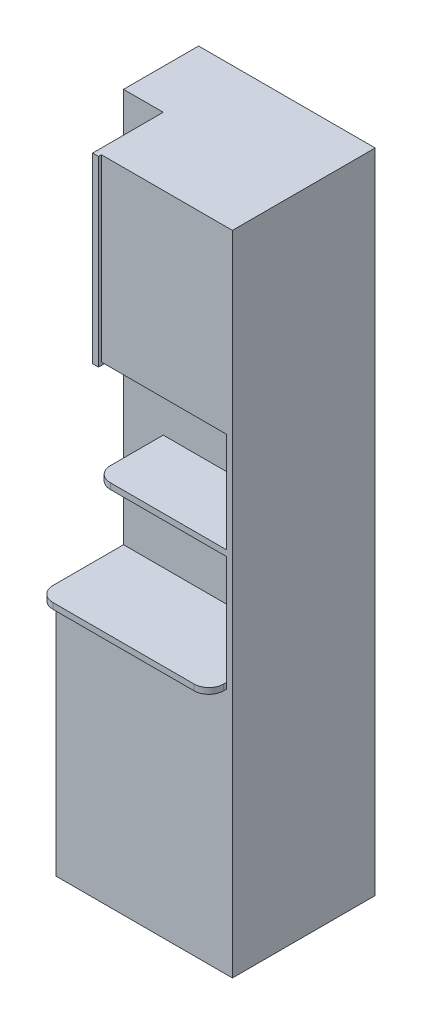
ISO-10303-21;
HEADER;
FILE_DESCRIPTION(('STEP AP214'),'2;1');
FILE_NAME('part.step','',(''),(''),'','','');
FILE_SCHEMA(('AUTOMOTIVE_DESIGN { 1 0 10303 214 1 1 1 1 }'));
ENDSEC;
DATA;
#1=APPLICATION_CONTEXT('core data for automotive mechanical design processes');
#2=APPLICATION_PROTOCOL_DEFINITION('international standard','automotive_design',2000,#1);
#3=PRODUCT_CONTEXT('',#1,'mechanical');
#4=PRODUCT('Part','Part','',(#3));
#5=PRODUCT_RELATED_PRODUCT_CATEGORY('part','',(#4));
#6=PRODUCT_DEFINITION_FORMATION('','',#4);
#7=PRODUCT_DEFINITION_CONTEXT('part definition',#1,'design');
#8=PRODUCT_DEFINITION('design','',#6,#7);
#9=PRODUCT_DEFINITION_SHAPE('','',#8);
#10=(LENGTH_UNIT() NAMED_UNIT(*) SI_UNIT(.MILLI.,.METRE.));
#11=(NAMED_UNIT(*) PLANE_ANGLE_UNIT() SI_UNIT($,.RADIAN.));
#12=(NAMED_UNIT(*) SI_UNIT($,.STERADIAN.) SOLID_ANGLE_UNIT());
#13=UNCERTAINTY_MEASURE_WITH_UNIT(LENGTH_MEASURE(1.E-05),#10,'distance_accuracy_value','');
#14=(GEOMETRIC_REPRESENTATION_CONTEXT(3) GLOBAL_UNCERTAINTY_ASSIGNED_CONTEXT((#13)) GLOBAL_UNIT_ASSIGNED_CONTEXT((#10,
#11,#12)) REPRESENTATION_CONTEXT('',''));
#15=CARTESIAN_POINT('',(0.,0.,0.));
#16=DIRECTION('',(0.,0.,1.));
#17=DIRECTION('',(1.,0.,0.));
#18=AXIS2_PLACEMENT_3D('',#15,#16,#17);
#19=CARTESIAN_POINT('',(-0.165000000000005,1.09999999999999,0.255));
#20=DIRECTION('',(0.,0.,-1.));
#21=DIRECTION('',(0.,1.,0.));
#22=AXIS2_PLACEMENT_3D('',#19,#20,#21);
#23=PLANE('',#22);
#24=DIRECTION('',(-1.,0.,0.));
#25=VECTOR('',#24,1.);
#26=CARTESIAN_POINT('',(0.279999999999998,-0.239999999999999,0.255));
#27=LINE('',#26,#25);
#28=CARTESIAN_POINT('',(0.279999999999998,-0.239999999999999,0.255));
#29=VERTEX_POINT('',#28);
#30=CARTESIAN_POINT('',(-0.300000000000002,-0.239999999999999,0.255));
#31=VERTEX_POINT('',#30);
#32=EDGE_CURVE('E193',#29,#31,#27,.T.);
#33=ORIENTED_EDGE('',*,*,#32,.F.);
#34=DIRECTION('',(0.,-1.,0.));
#35=VECTOR('',#34,1.);
#36=CARTESIAN_POINT('',(0.279999999999997,0.130000000000002,0.255));
#37=LINE('',#36,#35);
#38=CARTESIAN_POINT('',(0.279999999999997,0.130000000000002,0.255));
#39=VERTEX_POINT('',#38);
#40=EDGE_CURVE('E180',#39,#29,#37,.T.);
#41=ORIENTED_EDGE('',*,*,#40,.F.);
#42=DIRECTION('',(-1.,0.,0.));
#43=VECTOR('',#42,1.);
#44=CARTESIAN_POINT('',(0.279999999999997,0.130000000000002,0.255));
#45=LINE('',#44,#43);
#46=CARTESIAN_POINT('',(-0.165000000000003,0.13,0.255));
#47=VERTEX_POINT('',#46);
#48=EDGE_CURVE('E320',#39,#47,#45,.T.);
#49=ORIENTED_EDGE('',*,*,#48,.T.);
#50=DIRECTION('',(0.,-1.,0.));
#51=VECTOR('',#50,1.);
#52=CARTESIAN_POINT('',(-0.165000000000005,1.09999999999999,0.255));
#53=LINE('',#52,#51);
#54=CARTESIAN_POINT('',(-0.165000000000003,0.150000000000001,0.255));
#55=VERTEX_POINT('',#54);
#56=EDGE_CURVE('E324',#55,#47,#53,.T.);
#57=ORIENTED_EDGE('',*,*,#56,.F.);
#58=DIRECTION('',(-1.,0.,0.));
#59=VECTOR('',#58,1.);
#60=CARTESIAN_POINT('',(0.279999999999997,0.150000000000002,0.255));
#61=LINE('',#60,#59);
#62=CARTESIAN_POINT('',(0.279999999999997,0.150000000000002,0.255));
#63=VERTEX_POINT('',#62);
#64=EDGE_CURVE('E308',#63,#55,#61,.T.);
#65=ORIENTED_EDGE('',*,*,#64,.F.);
#66=DIRECTION('',(0.,-1.,0.));
#67=VECTOR('',#66,1.);
#68=CARTESIAN_POINT('',(0.279999999999996,0.490000000000002,0.255));
#69=LINE('',#68,#67);
#70=CARTESIAN_POINT('',(0.279999999999996,0.490000000000002,0.255));
#71=VERTEX_POINT('',#70);
#72=EDGE_CURVE('E295',#71,#63,#69,.T.);
#73=ORIENTED_EDGE('',*,*,#72,.F.);
#74=DIRECTION('',(-1.,0.,0.));
#75=VECTOR('',#74,1.);
#76=CARTESIAN_POINT('',(0.279999999999996,0.490000000000002,0.255));
#77=LINE('',#76,#75);
#78=CARTESIAN_POINT('',(-0.145000000000004,0.490000000000001,0.255));
#79=VERTEX_POINT('',#78);
#80=EDGE_CURVE('E310',#71,#79,#77,.T.);
#81=ORIENTED_EDGE('',*,*,#80,.T.);
#82=DIRECTION('',(0.,-1.,0.));
#83=VECTOR('',#82,1.);
#84=CARTESIAN_POINT('',(-0.145000000000005,1.09999999999999,0.255));
#85=LINE('',#84,#83);
#86=CARTESIAN_POINT('',(-0.145000000000004,0.47999999999999,0.255));
#87=VERTEX_POINT('',#86);
#88=EDGE_CURVE('E266',#79,#87,#85,.T.);
#89=ORIENTED_EDGE('',*,*,#88,.T.);
#90=DIRECTION('',(1.,0.,0.));
#91=VECTOR('',#90,1.);
#92=CARTESIAN_POINT('',(-0.165000000000004,0.47999999999999,0.255));
#93=LINE('',#92,#91);
#94=CARTESIAN_POINT('',(-0.165000000000004,0.47999999999999,0.255));
#95=VERTEX_POINT('',#94);
#96=EDGE_CURVE('E279',#95,#87,#93,.T.);
#97=ORIENTED_EDGE('',*,*,#96,.F.);
#98=DIRECTION('',(0.,-1.,0.));
#99=VECTOR('',#98,1.);
#100=CARTESIAN_POINT('',(-0.165000000000005,1.09999999999999,0.255));
#101=LINE('',#100,#99);
#102=CARTESIAN_POINT('',(-0.165000000000005,1.09999999999999,0.255));
#103=VERTEX_POINT('',#102);
#104=EDGE_CURVE('E254',#103,#95,#101,.T.);
#105=ORIENTED_EDGE('',*,*,#104,.F.);
#106=DIRECTION('',(-1.,0.,0.));
#107=VECTOR('',#106,1.);
#108=CARTESIAN_POINT('',(-0.165000000000005,1.09999999999999,0.255));
#109=LINE('',#108,#107);
#110=CARTESIAN_POINT('',(-0.300000000000005,1.09999999999999,0.255));
#111=VERTEX_POINT('',#110);
#112=EDGE_CURVE('E327',#103,#111,#109,.T.);
#113=ORIENTED_EDGE('',*,*,#112,.T.);
#114=DIRECTION('',(0.,-1.,0.));
#115=VECTOR('',#114,1.);
#116=CARTESIAN_POINT('',(-0.300000000000005,1.09999999999999,0.255));
#117=LINE('',#116,#115);
#118=EDGE_CURVE('E195',#111,#31,#117,.T.);
#119=ORIENTED_EDGE('',*,*,#118,.T.);
#120=EDGE_LOOP('',(#33,#41,#49,#57,#65,#73,#81,#89,#97,#105,#113,#119));
#121=FACE_BOUND('',#120,.T.);
#122=ADVANCED_FACE('F33',(#121),#23,.F.);
#123=CARTESIAN_POINT('',(0.279999999999997,0.,0.));
#124=DIRECTION('',(1.,0.,0.));
#125=DIRECTION('',(0.,1.,0.));
#126=AXIS2_PLACEMENT_3D('',#123,#124,#125);
#127=PLANE('',#126);
#128=DIRECTION('',(0.,0.,-1.));
#129=VECTOR('',#128,1.);
#130=CARTESIAN_POINT('',(0.279999999999998,-0.239999999999998,0.));
#131=LINE('',#130,#129);
#132=CARTESIAN_POINT('',(0.279999999999998,-0.239999999999999,0.485));
#133=VERTEX_POINT('',#132);
#134=EDGE_CURVE('E184',#133,#29,#131,.T.);
#135=ORIENTED_EDGE('',*,*,#134,.F.);
#136=DIRECTION('',(0.,1.,0.));
#137=VECTOR('',#136,1.);
#138=CARTESIAN_POINT('',(0.279999999999997,0.130000000000002,0.485));
#139=LINE('',#138,#137);
#140=CARTESIAN_POINT('',(0.279999999999997,0.130000000000002,0.485));
#141=VERTEX_POINT('',#140);
#142=EDGE_CURVE('E317',#133,#141,#139,.T.);
#143=ORIENTED_EDGE('',*,*,#142,.T.);
#144=DIRECTION('',(0.,0.,-1.));
#145=VECTOR('',#144,1.);
#146=CARTESIAN_POINT('',(0.279999999999997,0.130000000000002,0.485));
#147=LINE('',#146,#145);
#148=EDGE_CURVE('E187',#141,#39,#147,.T.);
#149=ORIENTED_EDGE('',*,*,#148,.T.);
#150=ORIENTED_EDGE('',*,*,#40,.T.);
#151=EDGE_LOOP('',(#135,#143,#149,#150));
#152=FACE_BOUND('',#151,.T.);
#153=ADVANCED_FACE('F182',(#152),#127,.F.);
#154=CARTESIAN_POINT('',(-0.165000000000003,0.,0.));
#155=DIRECTION('',(1.,0.,0.));
#156=DIRECTION('',(0.,1.,0.));
#157=AXIS2_PLACEMENT_3D('',#154,#155,#156);
#158=PLANE('',#157);
#159=DIRECTION('',(0.,0.,-1.));
#160=VECTOR('',#159,1.);
#161=CARTESIAN_POINT('',(-0.165000000000003,0.13,0.485));
#162=LINE('',#161,#160);
#163=CARTESIAN_POINT('',(-0.165000000000003,0.13,0.435));
#164=VERTEX_POINT('',#163);
#165=EDGE_CURVE('E307',#164,#47,#162,.T.);
#166=ORIENTED_EDGE('',*,*,#165,.F.);
#167=DIRECTION('',(0.,1.,0.));
#168=VECTOR('',#167,1.);
#169=CARTESIAN_POINT('',(-0.165000000000003,0.,0.435));
#170=LINE('',#169,#168);
#171=CARTESIAN_POINT('',(-0.165000000000003,0.150000000000001,0.435));
#172=VERTEX_POINT('',#171);
#173=EDGE_CURVE('E220',#164,#172,#170,.T.);
#174=ORIENTED_EDGE('',*,*,#173,.T.);
#175=DIRECTION('',(0.,0.,1.));
#176=VECTOR('',#175,1.);
#177=CARTESIAN_POINT('',(-0.165000000000003,0.150000000000001,0.485));
#178=LINE('',#177,#176);
#179=EDGE_CURVE('E288',#55,#172,#178,.T.);
#180=ORIENTED_EDGE('',*,*,#179,.F.);
#181=ORIENTED_EDGE('',*,*,#56,.T.);
#182=EDGE_LOOP('',(#166,#174,#180,#181));
#183=FACE_BOUND('',#182,.T.);
#184=ADVANCED_FACE('F399',(#183),#158,.F.);
#185=CARTESIAN_POINT('',(-0.300000000000005,1.09999999999999,0.485));
#186=DIRECTION('',(1.,0.,0.));
#187=DIRECTION('',(0.,1.,0.));
#188=AXIS2_PLACEMENT_3D('',#185,#186,#187);
#189=PLANE('',#188);
#190=DIRECTION('',(0.,0.,1.));
#191=VECTOR('',#190,1.);
#192=CARTESIAN_POINT('',(-0.300000000000002,-0.26,0.255));
#193=LINE('',#192,#191);
#194=CARTESIAN_POINT('',(-0.300000000000002,-0.26,0.485));
#195=VERTEX_POINT('',#194);
#196=CARTESIAN_POINT('',(-0.300000000000002,-0.26,0.495));
#197=VERTEX_POINT('',#196);
#198=EDGE_CURVE('E244',#195,#197,#193,.T.);
#199=ORIENTED_EDGE('',*,*,#198,.T.);
#200=DIRECTION('',(0.,-1.,0.));
#201=VECTOR('',#200,1.);
#202=CARTESIAN_POINT('',(-0.300000000000005,1.09999999999999,0.495000000000001));
#203=LINE('',#202,#201);
#204=CARTESIAN_POINT('',(-0.300000000000002,-0.24,0.495));
#205=VERTEX_POINT('',#204);
#206=EDGE_CURVE('E216',#197,#205,#203,.F.);
#207=ORIENTED_EDGE('',*,*,#206,.T.);
#208=DIRECTION('',(0.,0.,1.));
#209=VECTOR('',#208,1.);
#210=CARTESIAN_POINT('',(-0.300000000000002,-0.24,0.255));
#211=LINE('',#210,#209);
#212=EDGE_CURVE('E199',#31,#205,#211,.T.);
#213=ORIENTED_EDGE('',*,*,#212,.F.);
#214=ORIENTED_EDGE('',*,*,#118,.F.);
#215=DIRECTION('',(0.,0.,-1.));
#216=VECTOR('',#215,1.);
#217=CARTESIAN_POINT('',(-0.300000000000005,1.09999999999999,0.485));
#218=LINE('',#217,#216);
#219=CARTESIAN_POINT('',(-0.300000000000005,1.09999999999999,0.));
#220=VERTEX_POINT('',#219);
#221=EDGE_CURVE('E341',#111,#220,#218,.T.);
#222=ORIENTED_EDGE('',*,*,#221,.T.);
#223=DIRECTION('',(0.,-1.,0.));
#224=VECTOR('',#223,1.);
#225=CARTESIAN_POINT('',(-0.300000000000005,1.09999999999999,0.));
#226=LINE('',#225,#224);
#227=CARTESIAN_POINT('',(-0.3,-1.1,0.));
#228=VERTEX_POINT('',#227);
#229=EDGE_CURVE('E330',#220,#228,#226,.T.);
#230=ORIENTED_EDGE('',*,*,#229,.T.);
#231=DIRECTION('',(0.,0.,-1.));
#232=VECTOR('',#231,1.);
#233=CARTESIAN_POINT('',(-0.3,-1.1,0.485));
#234=LINE('',#233,#232);
#235=CARTESIAN_POINT('',(-0.3,-1.1,0.485));
#236=VERTEX_POINT('',#235);
#237=EDGE_CURVE('E205',#236,#228,#234,.T.);
#238=ORIENTED_EDGE('',*,*,#237,.F.);
#239=DIRECTION('',(0.,-1.,0.));
#240=VECTOR('',#239,1.);
#241=CARTESIAN_POINT('',(-0.300000000000005,1.09999999999999,0.485));
#242=LINE('',#241,#240);
#243=EDGE_CURVE('E332',#195,#236,#242,.T.);
#244=ORIENTED_EDGE('',*,*,#243,.F.);
#245=EDGE_LOOP('',(#199,#207,#213,#214,#222,#230,#238,#244));
#246=FACE_BOUND('',#245,.T.);
#247=ADVANCED_FACE('F404',(#246),#189,.F.);
#248=CARTESIAN_POINT('',(0.3,-1.1,0.485));
#249=DIRECTION('',(0.,1.,0.));
#250=DIRECTION('',(0.,0.,1.));
#251=AXIS2_PLACEMENT_3D('',#248,#249,#250);
#252=PLANE('',#251);
#253=DIRECTION('',(1.,0.,0.));
#254=VECTOR('',#253,1.);
#255=CARTESIAN_POINT('',(0.3,-1.1,0.));
#256=LINE('',#255,#254);
#257=CARTESIAN_POINT('',(0.3,-1.1,0.));
#258=VERTEX_POINT('',#257);
#259=EDGE_CURVE('E344',#228,#258,#256,.T.);
#260=ORIENTED_EDGE('',*,*,#259,.T.);
#261=DIRECTION('',(0.,0.,-1.));
#262=VECTOR('',#261,1.);
#263=CARTESIAN_POINT('',(0.3,-1.1,0.485));
#264=LINE('',#263,#262);
#265=CARTESIAN_POINT('',(0.3,-1.1,0.485));
#266=VERTEX_POINT('',#265);
#267=EDGE_CURVE('E211',#266,#258,#264,.T.);
#268=ORIENTED_EDGE('',*,*,#267,.F.);
#269=DIRECTION('',(1.,0.,0.));
#270=VECTOR('',#269,1.);
#271=CARTESIAN_POINT('',(0.3,-1.1,0.485));
#272=LINE('',#271,#270);
#273=EDGE_CURVE('E334',#236,#266,#272,.T.);
#274=ORIENTED_EDGE('',*,*,#273,.F.);
#275=ORIENTED_EDGE('',*,*,#237,.T.);
#276=EDGE_LOOP('',(#260,#268,#274,#275));
#277=FACE_BOUND('',#276,.T.);
#278=ADVANCED_FACE('F433',(#277),#252,.F.);
#279=CARTESIAN_POINT('',(0.3,1.1,0.485));
#280=DIRECTION('',(-1.,0.,0.));
#281=DIRECTION('',(0.,-1.,0.));
#282=AXIS2_PLACEMENT_3D('',#279,#280,#281);
#283=PLANE('',#282);
#284=DIRECTION('',(0.,1.,0.));
#285=VECTOR('',#284,1.);
#286=CARTESIAN_POINT('',(0.3,1.1,0.));
#287=LINE('',#286,#285);
#288=CARTESIAN_POINT('',(0.3,1.1,0.));
#289=VERTEX_POINT('',#288);
#290=EDGE_CURVE('E346',#258,#289,#287,.T.);
#291=ORIENTED_EDGE('',*,*,#290,.T.);
#292=DIRECTION('',(0.,0.,-1.));
#293=VECTOR('',#292,1.);
#294=CARTESIAN_POINT('',(0.3,1.1,0.485));
#295=LINE('',#294,#293);
#296=CARTESIAN_POINT('',(0.3,1.1,0.485));
#297=VERTEX_POINT('',#296);
#298=EDGE_CURVE('E351',#297,#289,#295,.T.);
#299=ORIENTED_EDGE('',*,*,#298,.F.);
#300=DIRECTION('',(0.,1.,0.));
#301=VECTOR('',#300,1.);
#302=CARTESIAN_POINT('',(0.3,1.1,0.485));
#303=LINE('',#302,#301);
#304=EDGE_CURVE('E337',#266,#297,#303,.T.);
#305=ORIENTED_EDGE('',*,*,#304,.F.);
#306=ORIENTED_EDGE('',*,*,#267,.T.);
#307=EDGE_LOOP('',(#291,#299,#305,#306));
#308=FACE_BOUND('',#307,.T.);
#309=ADVANCED_FACE('F358',(#308),#283,.F.);
#310=CARTESIAN_POINT('',(0.3,1.1,0.485));
#311=DIRECTION('',(0.,-1.,0.));
#312=DIRECTION('',(1.,0.,0.));
#313=AXIS2_PLACEMENT_3D('',#310,#311,#312);
#314=PLANE('',#313);
#315=ORIENTED_EDGE('',*,*,#112,.F.);
#316=DIRECTION('',(0.,0.,-1.));
#317=VECTOR('',#316,1.);
#318=CARTESIAN_POINT('',(-0.165000000000005,1.09999999999999,0.255));
#319=LINE('',#318,#317);
#320=CARTESIAN_POINT('',(-0.165000000000005,1.09999999999999,0.495));
#321=VERTEX_POINT('',#320);
#322=EDGE_CURVE('E262',#321,#103,#319,.T.);
#323=ORIENTED_EDGE('',*,*,#322,.F.);
#324=DIRECTION('',(1.,0.,0.));
#325=VECTOR('',#324,1.);
#326=CARTESIAN_POINT('',(-0.165000000000005,1.09999999999999,0.495));
#327=LINE('',#326,#325);
#328=CARTESIAN_POINT('',(-0.145000000000005,1.09999999999999,0.495));
#329=VERTEX_POINT('',#328);
#330=EDGE_CURVE('E265',#321,#329,#327,.T.);
#331=ORIENTED_EDGE('',*,*,#330,.T.);
#332=DIRECTION('',(0.,0.,-1.));
#333=VECTOR('',#332,1.);
#334=CARTESIAN_POINT('',(-0.145000000000005,1.09999999999999,0.255));
#335=LINE('',#334,#333);
#336=CARTESIAN_POINT('',(-0.145000000000005,1.09999999999999,0.485));
#337=VERTEX_POINT('',#336);
#338=EDGE_CURVE('E258',#329,#337,#335,.T.);
#339=ORIENTED_EDGE('',*,*,#338,.T.);
#340=DIRECTION('',(-1.,0.,0.));
#341=VECTOR('',#340,1.);
#342=CARTESIAN_POINT('',(0.3,1.1,0.485));
#343=LINE('',#342,#341);
#344=EDGE_CURVE('E339',#297,#337,#343,.T.);
#345=ORIENTED_EDGE('',*,*,#344,.F.);
#346=ORIENTED_EDGE('',*,*,#298,.T.);
#347=DIRECTION('',(-1.,0.,0.));
#348=VECTOR('',#347,1.);
#349=CARTESIAN_POINT('',(0.3,1.1,0.));
#350=LINE('',#349,#348);
#351=EDGE_CURVE('E335',#289,#220,#350,.T.);
#352=ORIENTED_EDGE('',*,*,#351,.T.);
#353=ORIENTED_EDGE('',*,*,#221,.F.);
#354=EDGE_LOOP('',(#315,#323,#331,#339,#345,#346,#352,#353));
#355=FACE_BOUND('',#354,.T.);
#356=ADVANCED_FACE('F369',(#355),#314,.F.);
#357=CARTESIAN_POINT('',(0.,0.,0.485));
#358=DIRECTION('',(0.,0.,-1.));
#359=DIRECTION('',(-1.,0.,0.));
#360=AXIS2_PLACEMENT_3D('',#357,#358,#359);
#361=PLANE('',#360);
#362=DIRECTION('',(-1.,0.,0.));
#363=VECTOR('',#362,1.);
#364=CARTESIAN_POINT('',(0.279999999999997,0.150000000000002,0.485));
#365=LINE('',#364,#363);
#366=CARTESIAN_POINT('',(0.279999999999997,0.150000000000002,0.485));
#367=VERTEX_POINT('',#366);
#368=CARTESIAN_POINT('',(-0.115000000000003,0.150000000000001,0.485));
#369=VERTEX_POINT('',#368);
#370=EDGE_CURVE('E304',#367,#369,#365,.T.);
#371=ORIENTED_EDGE('',*,*,#370,.T.);
#372=DIRECTION('',(0.,1.,0.));
#373=VECTOR('',#372,1.);
#374=CARTESIAN_POINT('',(-0.115000000000003,0.,0.485));
#375=LINE('',#374,#373);
#376=CARTESIAN_POINT('',(-0.115000000000003,0.130000000000001,0.485));
#377=VERTEX_POINT('',#376);
#378=EDGE_CURVE('E225',#369,#377,#375,.F.);
#379=ORIENTED_EDGE('',*,*,#378,.T.);
#380=DIRECTION('',(-1.,0.,0.));
#381=VECTOR('',#380,1.);
#382=CARTESIAN_POINT('',(0.279999999999997,0.130000000000002,0.485));
#383=LINE('',#382,#381);
#384=EDGE_CURVE('E190',#141,#377,#383,.T.);
#385=ORIENTED_EDGE('',*,*,#384,.F.);
#386=ORIENTED_EDGE('',*,*,#142,.F.);
#387=CARTESIAN_POINT('',(0.279999999999998,-0.259999999999999,0.485));
#388=VERTEX_POINT('',#387);
#389=EDGE_CURVE('E315',#388,#133,#139,.T.);
#390=ORIENTED_EDGE('',*,*,#389,.F.);
#391=DIRECTION('',(-1.,0.,0.));
#392=VECTOR('',#391,1.);
#393=CARTESIAN_POINT('',(-0.165000000000002,-0.26,0.485));
#394=LINE('',#393,#392);
#395=EDGE_CURVE('E243',#388,#195,#394,.T.);
#396=ORIENTED_EDGE('',*,*,#395,.T.);
#397=ORIENTED_EDGE('',*,*,#243,.T.);
#398=ORIENTED_EDGE('',*,*,#273,.T.);
#399=ORIENTED_EDGE('',*,*,#304,.T.);
#400=ORIENTED_EDGE('',*,*,#344,.T.);
#401=DIRECTION('',(0.,1.,0.));
#402=VECTOR('',#401,1.);
#403=CARTESIAN_POINT('',(-0.145000000000005,1.09999999999999,0.485));
#404=LINE('',#403,#402);
#405=CARTESIAN_POINT('',(-0.145000000000004,0.490000000000001,0.485));
#406=VERTEX_POINT('',#405);
#407=EDGE_CURVE('E282',#406,#337,#404,.T.);
#408=ORIENTED_EDGE('',*,*,#407,.F.);
#409=DIRECTION('',(-1.,0.,0.));
#410=VECTOR('',#409,1.);
#411=CARTESIAN_POINT('',(0.279999999999996,0.490000000000002,0.485));
#412=LINE('',#411,#410);
#413=CARTESIAN_POINT('',(0.279999999999996,0.490000000000002,0.485));
#414=VERTEX_POINT('',#413);
#415=EDGE_CURVE('E301',#414,#406,#412,.T.);
#416=ORIENTED_EDGE('',*,*,#415,.F.);
#417=DIRECTION('',(0.,1.,0.));
#418=VECTOR('',#417,1.);
#419=CARTESIAN_POINT('',(0.279999999999996,0.490000000000002,0.485));
#420=LINE('',#419,#418);
#421=EDGE_CURVE('E289',#367,#414,#420,.T.);
#422=ORIENTED_EDGE('',*,*,#421,.F.);
#423=EDGE_LOOP('',(#371,#379,#385,#386,#390,#396,#397,#398,#399,#400,#408,#416,#422));
#424=FACE_BOUND('',#423,.T.);
#425=ADVANCED_FACE('F373',(#424),#361,.F.);
#426=CARTESIAN_POINT('',(0.,0.,0.));
#427=DIRECTION('',(0.,0.,-1.));
#428=DIRECTION('',(-1.,0.,0.));
#429=AXIS2_PLACEMENT_3D('',#426,#427,#428);
#430=PLANE('',#429);
#431=ORIENTED_EDGE('',*,*,#229,.F.);
#432=ORIENTED_EDGE('',*,*,#351,.F.);
#433=ORIENTED_EDGE('',*,*,#290,.F.);
#434=ORIENTED_EDGE('',*,*,#259,.F.);
#435=EDGE_LOOP('',(#431,#432,#433,#434));
#436=FACE_BOUND('',#435,.T.);
#437=ADVANCED_FACE('F365',(#436),#430,.T.);
#438=CARTESIAN_POINT('',(0.279999999999997,0.130000000000002,0.485));
#439=DIRECTION('',(0.,1.,0.));
#440=DIRECTION('',(-1.,0.,0.));
#441=AXIS2_PLACEMENT_3D('',#438,#439,#440);
#442=PLANE('',#441);
#443=ORIENTED_EDGE('',*,*,#384,.T.);
#444=CARTESIAN_POINT('',(-0.115000000000003,0.130000000000001,0.435));
#445=DIRECTION('',(0.,1.,0.));
#446=DIRECTION('',(-1.,0.,0.));
#447=AXIS2_PLACEMENT_3D('',#444,#445,#446);
#448=CIRCLE('',#447,0.05);
#449=EDGE_CURVE('E227',#377,#164,#448,.F.);
#450=ORIENTED_EDGE('',*,*,#449,.T.);
#451=ORIENTED_EDGE('',*,*,#165,.T.);
#452=ORIENTED_EDGE('',*,*,#48,.F.);
#453=ORIENTED_EDGE('',*,*,#148,.F.);
#454=EDGE_LOOP('',(#443,#450,#451,#452,#453));
#455=FACE_BOUND('',#454,.T.);
#456=ADVANCED_FACE('F397',(#455),#442,.F.);
#457=CARTESIAN_POINT('',(0.279999999999997,0.150000000000002,0.485));
#458=DIRECTION('',(0.,-1.,0.));
#459=DIRECTION('',(1.,0.,0.));
#460=AXIS2_PLACEMENT_3D('',#457,#458,#459);
#461=PLANE('',#460);
#462=ORIENTED_EDGE('',*,*,#179,.T.);
#463=CARTESIAN_POINT('',(-0.115000000000003,0.150000000000001,0.435));
#464=DIRECTION('',(0.,-1.,0.));
#465=DIRECTION('',(1.,0.,0.));
#466=AXIS2_PLACEMENT_3D('',#463,#464,#465);
#467=CIRCLE('',#466,0.05);
#468=EDGE_CURVE('E223',#172,#369,#467,.F.);
#469=ORIENTED_EDGE('',*,*,#468,.T.);
#470=ORIENTED_EDGE('',*,*,#370,.F.);
#471=DIRECTION('',(0.,0.,1.));
#472=VECTOR('',#471,1.);
#473=CARTESIAN_POINT('',(0.279999999999997,0.150000000000002,0.485));
#474=LINE('',#473,#472);
#475=EDGE_CURVE('E298',#63,#367,#474,.T.);
#476=ORIENTED_EDGE('',*,*,#475,.F.);
#477=ORIENTED_EDGE('',*,*,#64,.T.);
#478=EDGE_LOOP('',(#462,#469,#470,#476,#477));
#479=FACE_BOUND('',#478,.T.);
#480=ADVANCED_FACE('F468',(#479),#461,.F.);
#481=CARTESIAN_POINT('',(0.279999999999996,0.490000000000002,0.485));
#482=DIRECTION('',(0.,1.,0.));
#483=DIRECTION('',(-1.,0.,0.));
#484=AXIS2_PLACEMENT_3D('',#481,#482,#483);
#485=PLANE('',#484);
#486=ORIENTED_EDGE('',*,*,#415,.T.);
#487=DIRECTION('',(0.,0.,1.));
#488=VECTOR('',#487,1.);
#489=CARTESIAN_POINT('',(-0.145000000000004,0.490000000000001,0.485));
#490=LINE('',#489,#488);
#491=EDGE_CURVE('E285',#79,#406,#490,.T.);
#492=ORIENTED_EDGE('',*,*,#491,.F.);
#493=ORIENTED_EDGE('',*,*,#80,.F.);
#494=DIRECTION('',(0.,0.,-1.));
#495=VECTOR('',#494,1.);
#496=CARTESIAN_POINT('',(0.279999999999996,0.490000000000002,0.485));
#497=LINE('',#496,#495);
#498=EDGE_CURVE('E292',#414,#71,#497,.T.);
#499=ORIENTED_EDGE('',*,*,#498,.F.);
#500=EDGE_LOOP('',(#486,#492,#493,#499));
#501=FACE_BOUND('',#500,.T.);
#502=ADVANCED_FACE('F381',(#501),#485,.F.);
#503=CARTESIAN_POINT('',(0.279999999999997,0.,0.));
#504=DIRECTION('',(1.,0.,0.));
#505=DIRECTION('',(0.,1.,0.));
#506=AXIS2_PLACEMENT_3D('',#503,#504,#505);
#507=PLANE('',#506);
#508=ORIENTED_EDGE('',*,*,#421,.T.);
#509=ORIENTED_EDGE('',*,*,#498,.T.);
#510=ORIENTED_EDGE('',*,*,#72,.T.);
#511=ORIENTED_EDGE('',*,*,#475,.T.);
#512=EDGE_LOOP('',(#508,#509,#510,#511));
#513=FACE_BOUND('',#512,.T.);
#514=ADVANCED_FACE('F386',(#513),#507,.F.);
#515=CARTESIAN_POINT('',(-0.145000000000003,0.,0.));
#516=DIRECTION('',(-1.,0.,0.));
#517=DIRECTION('',(0.,-1.,0.));
#518=AXIS2_PLACEMENT_3D('',#515,#516,#517);
#519=PLANE('',#518);
#520=ORIENTED_EDGE('',*,*,#491,.T.);
#521=ORIENTED_EDGE('',*,*,#407,.T.);
#522=ORIENTED_EDGE('',*,*,#338,.F.);
#523=DIRECTION('',(0.,1.,0.));
#524=VECTOR('',#523,1.);
#525=CARTESIAN_POINT('',(-0.145000000000005,1.09999999999999,0.495));
#526=LINE('',#525,#524);
#527=CARTESIAN_POINT('',(-0.145000000000004,0.47999999999999,0.495));
#528=VERTEX_POINT('',#527);
#529=EDGE_CURVE('E270',#528,#329,#526,.T.);
#530=ORIENTED_EDGE('',*,*,#529,.F.);
#531=DIRECTION('',(0.,0.,1.));
#532=VECTOR('',#531,1.);
#533=CARTESIAN_POINT('',(-0.145000000000004,0.47999999999999,0.255));
#534=LINE('',#533,#532);
#535=EDGE_CURVE('E268',#87,#528,#534,.T.);
#536=ORIENTED_EDGE('',*,*,#535,.F.);
#537=ORIENTED_EDGE('',*,*,#88,.F.);
#538=EDGE_LOOP('',(#520,#521,#522,#530,#536,#537));
#539=FACE_BOUND('',#538,.T.);
#540=ADVANCED_FACE('F376',(#539),#519,.F.);
#541=CARTESIAN_POINT('',(-0.165000000000004,0.47999999999999,0.255));
#542=DIRECTION('',(0.,1.,0.));
#543=DIRECTION('',(-1.,0.,0.));
#544=AXIS2_PLACEMENT_3D('',#541,#542,#543);
#545=PLANE('',#544);
#546=ORIENTED_EDGE('',*,*,#535,.T.);
#547=DIRECTION('',(1.,0.,0.));
#548=VECTOR('',#547,1.);
#549=CARTESIAN_POINT('',(-0.165000000000004,0.47999999999999,0.495));
#550=LINE('',#549,#548);
#551=CARTESIAN_POINT('',(-0.165000000000004,0.47999999999999,0.495));
#552=VERTEX_POINT('',#551);
#553=EDGE_CURVE('E276',#552,#528,#550,.T.);
#554=ORIENTED_EDGE('',*,*,#553,.F.);
#555=DIRECTION('',(0.,0.,1.));
#556=VECTOR('',#555,1.);
#557=CARTESIAN_POINT('',(-0.165000000000004,0.47999999999999,0.255));
#558=LINE('',#557,#556);
#559=EDGE_CURVE('E257',#95,#552,#558,.T.);
#560=ORIENTED_EDGE('',*,*,#559,.F.);
#561=ORIENTED_EDGE('',*,*,#96,.T.);
#562=EDGE_LOOP('',(#546,#554,#560,#561));
#563=FACE_BOUND('',#562,.T.);
#564=ADVANCED_FACE('F459',(#563),#545,.F.);
#565=CARTESIAN_POINT('',(-0.165000000000005,1.09999999999999,0.495));
#566=DIRECTION('',(0.,0.,-1.));
#567=DIRECTION('',(0.,1.,0.));
#568=AXIS2_PLACEMENT_3D('',#565,#566,#567);
#569=PLANE('',#568);
#570=ORIENTED_EDGE('',*,*,#529,.T.);
#571=ORIENTED_EDGE('',*,*,#330,.F.);
#572=DIRECTION('',(0.,1.,0.));
#573=VECTOR('',#572,1.);
#574=CARTESIAN_POINT('',(-0.165000000000005,1.09999999999999,0.495));
#575=LINE('',#574,#573);
#576=EDGE_CURVE('E260',#552,#321,#575,.T.);
#577=ORIENTED_EDGE('',*,*,#576,.F.);
#578=ORIENTED_EDGE('',*,*,#553,.T.);
#579=EDGE_LOOP('',(#570,#571,#577,#578));
#580=FACE_BOUND('',#579,.T.);
#581=ADVANCED_FACE('F455',(#580),#569,.F.);
#582=CARTESIAN_POINT('',(-0.165000000000003,0.,0.));
#583=DIRECTION('',(-1.,0.,0.));
#584=DIRECTION('',(0.,-1.,0.));
#585=AXIS2_PLACEMENT_3D('',#582,#583,#584);
#586=PLANE('',#585);
#587=ORIENTED_EDGE('',*,*,#104,.T.);
#588=ORIENTED_EDGE('',*,*,#559,.T.);
#589=ORIENTED_EDGE('',*,*,#576,.T.);
#590=ORIENTED_EDGE('',*,*,#322,.T.);
#591=EDGE_LOOP('',(#587,#588,#589,#590));
#592=FACE_BOUND('',#591,.T.);
#593=ADVANCED_FACE('F452',(#592),#586,.T.);
#594=CARTESIAN_POINT('',(0.279999999999998,-0.239999999999999,0.255));
#595=DIRECTION('',(-1.,0.,0.));
#596=DIRECTION('',(0.,-1.,0.));
#597=AXIS2_PLACEMENT_3D('',#594,#595,#596);
#598=PLANE('',#597);
#599=DIRECTION('',(0.,0.,-1.));
#600=VECTOR('',#599,1.);
#601=CARTESIAN_POINT('',(0.279999999999998,-0.239999999999999,0.255));
#602=LINE('',#601,#600);
#603=CARTESIAN_POINT('',(0.279999999999998,-0.239999999999999,0.495));
#604=VERTEX_POINT('',#603);
#605=EDGE_CURVE('E200',#604,#133,#602,.T.);
#606=ORIENTED_EDGE('',*,*,#605,.F.);
#607=DIRECTION('',(0.,-1.,0.));
#608=VECTOR('',#607,1.);
#609=CARTESIAN_POINT('',(0.279999999999998,-0.239999999999999,0.495));
#610=LINE('',#609,#608);
#611=CARTESIAN_POINT('',(0.279999999999998,-0.259999999999999,0.495));
#612=VERTEX_POINT('',#611);
#613=EDGE_CURVE('E229',#604,#612,#610,.T.);
#614=ORIENTED_EDGE('',*,*,#613,.T.);
#615=DIRECTION('',(0.,0.,-1.));
#616=VECTOR('',#615,1.);
#617=CARTESIAN_POINT('',(0.279999999999998,-0.259999999999999,0.255));
#618=LINE('',#617,#616);
#619=EDGE_CURVE('E236',#612,#388,#618,.T.);
#620=ORIENTED_EDGE('',*,*,#619,.T.);
#621=ORIENTED_EDGE('',*,*,#389,.T.);
#622=EDGE_LOOP('',(#606,#614,#620,#621));
#623=FACE_BOUND('',#622,.T.);
#624=ADVANCED_FACE('F234',(#623),#598,.F.);
#625=CARTESIAN_POINT('',(0.,-0.259999999999999,0.));
#626=DIRECTION('',(0.,-1.,0.));
#627=DIRECTION('',(1.,0.,0.));
#628=AXIS2_PLACEMENT_3D('',#625,#626,#627);
#629=PLANE('',#628);
#630=ORIENTED_EDGE('',*,*,#619,.F.);
#631=CARTESIAN_POINT('',(0.229999999999998,-0.259999999999999,0.495));
#632=DIRECTION('',(0.,-1.,0.));
#633=DIRECTION('',(1.,0.,0.));
#634=AXIS2_PLACEMENT_3D('',#631,#632,#633);
#635=CIRCLE('',#634,0.05);
#636=CARTESIAN_POINT('',(0.229999999999998,-0.259999999999999,0.545));
#637=VERTEX_POINT('',#636);
#638=EDGE_CURVE('E55',#612,#637,#635,.T.);
#639=ORIENTED_EDGE('',*,*,#638,.T.);
#640=DIRECTION('',(1.,0.,0.));
#641=VECTOR('',#640,1.);
#642=CARTESIAN_POINT('',(0.279999999999998,-0.259999999999999,0.545));
#643=LINE('',#642,#641);
#644=CARTESIAN_POINT('',(-0.250000000000002,-0.26,0.545));
#645=VERTEX_POINT('',#644);
#646=EDGE_CURVE('E247',#645,#637,#643,.T.);
#647=ORIENTED_EDGE('',*,*,#646,.F.);
#648=CARTESIAN_POINT('',(-0.250000000000002,-0.26,0.495));
#649=DIRECTION('',(0.,-1.,0.));
#650=DIRECTION('',(1.,0.,0.));
#651=AXIS2_PLACEMENT_3D('',#648,#649,#650);
#652=CIRCLE('',#651,0.05);
#653=EDGE_CURVE('E208',#645,#197,#652,.T.);
#654=ORIENTED_EDGE('',*,*,#653,.T.);
#655=ORIENTED_EDGE('',*,*,#198,.F.);
#656=ORIENTED_EDGE('',*,*,#395,.F.);
#657=EDGE_LOOP('',(#630,#639,#647,#654,#655,#656));
#658=FACE_BOUND('',#657,.T.);
#659=ADVANCED_FACE('F241',(#658),#629,.T.);
#660=CARTESIAN_POINT('',(0.279999999999998,-0.239999999999999,0.545));
#661=DIRECTION('',(0.,0.,-1.));
#662=DIRECTION('',(0.,1.,0.));
#663=AXIS2_PLACEMENT_3D('',#660,#661,#662);
#664=PLANE('',#663);
#665=ORIENTED_EDGE('',*,*,#646,.T.);
#666=DIRECTION('',(0.,-1.,0.));
#667=VECTOR('',#666,1.);
#668=CARTESIAN_POINT('',(0.229999999999998,-0.239999999999999,0.545));
#669=LINE('',#668,#667);
#670=CARTESIAN_POINT('',(0.229999999999998,-0.239999999999999,0.545));
#671=VERTEX_POINT('',#670);
#672=EDGE_CURVE('E41',#637,#671,#669,.F.);
#673=ORIENTED_EDGE('',*,*,#672,.T.);
#674=DIRECTION('',(1.,0.,0.));
#675=VECTOR('',#674,1.);
#676=CARTESIAN_POINT('',(0.279999999999998,-0.239999999999999,0.545));
#677=LINE('',#676,#675);
#678=CARTESIAN_POINT('',(-0.250000000000002,-0.24,0.545));
#679=VERTEX_POINT('',#678);
#680=EDGE_CURVE('E250',#679,#671,#677,.T.);
#681=ORIENTED_EDGE('',*,*,#680,.F.);
#682=DIRECTION('',(0.,-1.,0.));
#683=VECTOR('',#682,1.);
#684=CARTESIAN_POINT('',(-0.250000000000002,-0.24,0.545));
#685=LINE('',#684,#683);
#686=EDGE_CURVE('E204',#679,#645,#685,.T.);
#687=ORIENTED_EDGE('',*,*,#686,.T.);
#688=EDGE_LOOP('',(#665,#673,#681,#687));
#689=FACE_BOUND('',#688,.T.);
#690=ADVANCED_FACE('F410',(#689),#664,.F.);
#691=CARTESIAN_POINT('',(0.,-0.239999999999999,0.));
#692=DIRECTION('',(0.,-1.,0.));
#693=DIRECTION('',(1.,0.,0.));
#694=AXIS2_PLACEMENT_3D('',#691,#692,#693);
#695=PLANE('',#694);
#696=ORIENTED_EDGE('',*,*,#680,.T.);
#697=CARTESIAN_POINT('',(0.229999999999998,-0.239999999999999,0.495));
#698=DIRECTION('',(0.,-1.,0.));
#699=DIRECTION('',(1.,0.,0.));
#700=AXIS2_PLACEMENT_3D('',#697,#698,#699);
#701=CIRCLE('',#700,0.05);
#702=EDGE_CURVE('E11',#671,#604,#701,.F.);
#703=ORIENTED_EDGE('',*,*,#702,.T.);
#704=ORIENTED_EDGE('',*,*,#605,.T.);
#705=ORIENTED_EDGE('',*,*,#134,.T.);
#706=ORIENTED_EDGE('',*,*,#32,.T.);
#707=ORIENTED_EDGE('',*,*,#212,.T.);
#708=CARTESIAN_POINT('',(-0.250000000000002,-0.24,0.495));
#709=DIRECTION('',(0.,-1.,0.));
#710=DIRECTION('',(1.,0.,0.));
#711=AXIS2_PLACEMENT_3D('',#708,#709,#710);
#712=CIRCLE('',#711,0.05);
#713=EDGE_CURVE('E218',#205,#679,#712,.F.);
#714=ORIENTED_EDGE('',*,*,#713,.T.);
#715=EDGE_LOOP('',(#696,#703,#704,#705,#706,#707,#714));
#716=FACE_BOUND('',#715,.T.);
#717=ADVANCED_FACE('F202',(#716),#695,.F.);
#718=CARTESIAN_POINT('',(-0.250000000000002,-0.24,0.495));
#719=DIRECTION('',(0.,-1.,0.));
#720=DIRECTION('',(1.,0.,0.));
#721=AXIS2_PLACEMENT_3D('',#718,#719,#720);
#722=CYLINDRICAL_SURFACE('',#721,0.05);
#723=ORIENTED_EDGE('',*,*,#713,.F.);
#724=ORIENTED_EDGE('',*,*,#206,.F.);
#725=ORIENTED_EDGE('',*,*,#653,.F.);
#726=ORIENTED_EDGE('',*,*,#686,.F.);
#727=EDGE_LOOP('',(#723,#724,#725,#726));
#728=FACE_BOUND('',#727,.T.);
#729=ADVANCED_FACE('F409',(#728),#722,.T.);
#730=CARTESIAN_POINT('',(-0.115000000000003,0.,0.435));
#731=DIRECTION('',(0.,1.,0.));
#732=DIRECTION('',(-1.,0.,0.));
#733=AXIS2_PLACEMENT_3D('',#730,#731,#732);
#734=CYLINDRICAL_SURFACE('',#733,0.05);
#735=ORIENTED_EDGE('',*,*,#449,.F.);
#736=ORIENTED_EDGE('',*,*,#378,.F.);
#737=ORIENTED_EDGE('',*,*,#468,.F.);
#738=ORIENTED_EDGE('',*,*,#173,.F.);
#739=EDGE_LOOP('',(#735,#736,#737,#738));
#740=FACE_BOUND('',#739,.T.);
#741=ADVANCED_FACE('F393',(#740),#734,.T.);
#742=CARTESIAN_POINT('',(0.229999999999998,-0.239999999999999,0.495));
#743=DIRECTION('',(0.,-1.,0.));
#744=DIRECTION('',(1.,0.,0.));
#745=AXIS2_PLACEMENT_3D('',#742,#743,#744);
#746=CYLINDRICAL_SURFACE('',#745,0.05);
#747=ORIENTED_EDGE('',*,*,#702,.F.);
#748=ORIENTED_EDGE('',*,*,#672,.F.);
#749=ORIENTED_EDGE('',*,*,#638,.F.);
#750=ORIENTED_EDGE('',*,*,#613,.F.);
#751=EDGE_LOOP('',(#747,#748,#749,#750));
#752=FACE_BOUND('',#751,.T.);
#753=ADVANCED_FACE('F35',(#752),#746,.T.);
#754=CLOSED_SHELL('',(#122,#153,#184,#247,#278,#309,#356,#425,#437,#456,#480,#502,#514,#540,
#564,#581,#593,#624,#659,#690,#717,#729,#741,#753));
#755=MANIFOLD_SOLID_BREP('B2',#754);
#756=ADVANCED_BREP_SHAPE_REPRESENTATION('',(#18,#755),#14);
#757=SHAPE_DEFINITION_REPRESENTATION(#9,#756);
ENDSEC;
END-ISO-10303-21;
